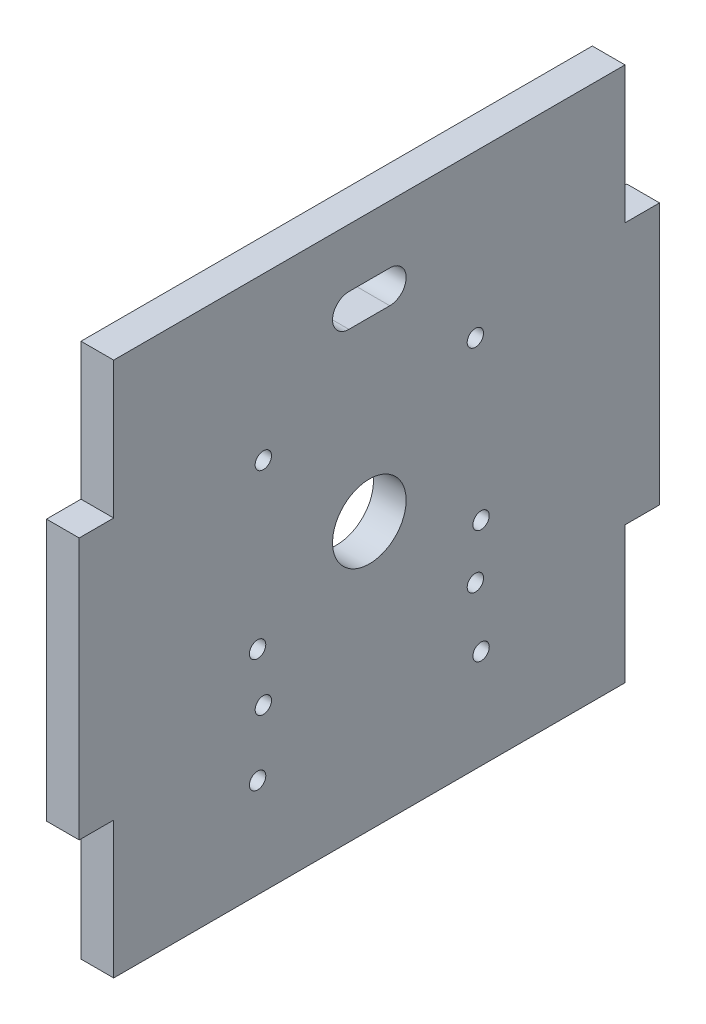
ISO-10303-21;
HEADER;
FILE_DESCRIPTION(('STEP AP214'),'2;1');
FILE_NAME('part.step','',(''),(''),'','','');
FILE_SCHEMA(('AUTOMOTIVE_DESIGN { 1 0 10303 214 1 1 1 1 }'));
ENDSEC;
DATA;
#1=APPLICATION_CONTEXT('core data for automotive mechanical design processes');
#2=APPLICATION_PROTOCOL_DEFINITION('international standard','automotive_design',2000,#1);
#3=PRODUCT_CONTEXT('',#1,'mechanical');
#4=PRODUCT('Part','Part','',(#3));
#5=PRODUCT_RELATED_PRODUCT_CATEGORY('part','',(#4));
#6=PRODUCT_DEFINITION_FORMATION('','',#4);
#7=PRODUCT_DEFINITION_CONTEXT('part definition',#1,'design');
#8=PRODUCT_DEFINITION('design','',#6,#7);
#9=PRODUCT_DEFINITION_SHAPE('','',#8);
#10=(LENGTH_UNIT() NAMED_UNIT(*) SI_UNIT(.MILLI.,.METRE.));
#11=(NAMED_UNIT(*) PLANE_ANGLE_UNIT() SI_UNIT($,.RADIAN.));
#12=(NAMED_UNIT(*) SI_UNIT($,.STERADIAN.) SOLID_ANGLE_UNIT());
#13=UNCERTAINTY_MEASURE_WITH_UNIT(LENGTH_MEASURE(1.E-05),#10,'distance_accuracy_value','');
#14=(GEOMETRIC_REPRESENTATION_CONTEXT(3) GLOBAL_UNCERTAINTY_ASSIGNED_CONTEXT((#13)) GLOBAL_UNIT_ASSIGNED_CONTEXT((#10,
#11,#12)) REPRESENTATION_CONTEXT('',''));
#15=CARTESIAN_POINT('',(0.,0.,0.));
#16=DIRECTION('',(0.,0.,1.));
#17=DIRECTION('',(1.,0.,0.));
#18=AXIS2_PLACEMENT_3D('',#15,#16,#17);
#19=CARTESIAN_POINT('',(431.8,0.,49.6542690784834));
#20=DIRECTION('',(0.,0.,1.));
#21=DIRECTION('',(0.,-1.,0.));
#22=AXIS2_PLACEMENT_3D('',#19,#20,#21);
#23=PLANE('',#22);
#24=DIRECTION('',(0.,-1.,0.));
#25=VECTOR('',#24,1.);
#26=CARTESIAN_POINT('',(438.15,0.,49.6542690784834));
#27=LINE('',#26,#25);
#28=CARTESIAN_POINT('',(438.15,-107.298670187723,49.6542690784833));
#29=VERTEX_POINT('',#28);
#30=CARTESIAN_POINT('',(438.15,-133.862812240734,49.6542690784833));
#31=VERTEX_POINT('',#30);
#32=EDGE_CURVE('E218',#29,#31,#27,.T.);
#33=ORIENTED_EDGE('',*,*,#32,.F.);
#34=DIRECTION('',(1.,0.,0.));
#35=VECTOR('',#34,1.);
#36=CARTESIAN_POINT('',(431.8,-107.298670187723,49.6542690784833));
#37=LINE('',#36,#35);
#38=CARTESIAN_POINT('',(431.8,-107.298670187723,49.6542690784833));
#39=VERTEX_POINT('',#38);
#40=EDGE_CURVE('E11',#39,#29,#37,.T.);
#41=ORIENTED_EDGE('',*,*,#40,.F.);
#42=DIRECTION('',(0.,-1.,0.));
#43=VECTOR('',#42,1.);
#44=CARTESIAN_POINT('',(431.8,0.,49.6542690784834));
#45=LINE('',#44,#43);
#46=CARTESIAN_POINT('',(431.8,-133.862812240734,49.6542690784833));
#47=VERTEX_POINT('',#46);
#48=EDGE_CURVE('E328',#39,#47,#45,.T.);
#49=ORIENTED_EDGE('',*,*,#48,.T.);
#50=DIRECTION('',(1.,0.,0.));
#51=VECTOR('',#50,1.);
#52=CARTESIAN_POINT('',(431.8,-133.862812240734,49.6542690784833));
#53=LINE('',#52,#51);
#54=EDGE_CURVE('E270',#47,#31,#53,.T.);
#55=ORIENTED_EDGE('',*,*,#54,.T.);
#56=EDGE_LOOP('',(#33,#41,#49,#55));
#57=FACE_BOUND('',#56,.T.);
#58=ADVANCED_FACE('F35',(#57),#23,.T.);
#59=CARTESIAN_POINT('',(431.8,-107.298670187723,-2.22183290934961E-13));
#60=DIRECTION('',(0.,-1.,0.));
#61=DIRECTION('',(0.,0.,-1.));
#62=AXIS2_PLACEMENT_3D('',#59,#60,#61);
#63=PLANE('',#62);
#64=DIRECTION('',(0.,0.,-1.));
#65=VECTOR('',#64,1.);
#66=CARTESIAN_POINT('',(438.15,-107.298670187723,-2.22183290934961E-13));
#67=LINE('',#66,#65);
#68=CARTESIAN_POINT('',(438.15,-107.298670187723,56.3562499999999));
#69=VERTEX_POINT('',#68);
#70=EDGE_CURVE('E248',#69,#29,#67,.T.);
#71=ORIENTED_EDGE('',*,*,#70,.F.);
#72=DIRECTION('',(1.,0.,0.));
#73=VECTOR('',#72,1.);
#74=CARTESIAN_POINT('',(431.8,-107.298670187723,56.3562499999999));
#75=LINE('',#74,#73);
#76=CARTESIAN_POINT('',(431.8,-107.298670187723,56.3562499999999));
#77=VERTEX_POINT('',#76);
#78=EDGE_CURVE('E45',#77,#69,#75,.T.);
#79=ORIENTED_EDGE('',*,*,#78,.F.);
#80=DIRECTION('',(0.,0.,-1.));
#81=VECTOR('',#80,1.);
#82=CARTESIAN_POINT('',(431.8,-107.298670187723,-2.22183290934961E-13));
#83=LINE('',#82,#81);
#84=EDGE_CURVE('E170',#77,#39,#83,.T.);
#85=ORIENTED_EDGE('',*,*,#84,.T.);
#86=ORIENTED_EDGE('',*,*,#40,.T.);
#87=EDGE_LOOP('',(#71,#79,#85,#86));
#88=FACE_BOUND('',#87,.T.);
#89=ADVANCED_FACE('F375',(#88),#63,.T.);
#90=CARTESIAN_POINT('',(431.8,0.,56.35625));
#91=DIRECTION('',(0.,0.,1.));
#92=DIRECTION('',(0.,-1.,0.));
#93=AXIS2_PLACEMENT_3D('',#90,#91,#92);
#94=PLANE('',#93);
#95=DIRECTION('',(0.,-1.,0.));
#96=VECTOR('',#95,1.);
#97=CARTESIAN_POINT('',(438.15,0.,56.35625));
#98=LINE('',#97,#96);
#99=CARTESIAN_POINT('',(438.15,-56.4986701877232,56.3562499999999));
#100=VERTEX_POINT('',#99);
#101=EDGE_CURVE('E158',#100,#69,#98,.T.);
#102=ORIENTED_EDGE('',*,*,#101,.F.);
#103=DIRECTION('',(1.,0.,0.));
#104=VECTOR('',#103,1.);
#105=CARTESIAN_POINT('',(431.8,-56.4986701877232,56.3562499999999));
#106=LINE('',#105,#104);
#107=CARTESIAN_POINT('',(431.8,-56.4986701877232,56.3562499999999));
#108=VERTEX_POINT('',#107);
#109=EDGE_CURVE('E153',#108,#100,#106,.T.);
#110=ORIENTED_EDGE('',*,*,#109,.F.);
#111=DIRECTION('',(0.,-1.,0.));
#112=VECTOR('',#111,1.);
#113=CARTESIAN_POINT('',(431.8,0.,56.35625));
#114=LINE('',#113,#112);
#115=EDGE_CURVE('E156',#108,#77,#114,.T.);
#116=ORIENTED_EDGE('',*,*,#115,.T.);
#117=ORIENTED_EDGE('',*,*,#78,.T.);
#118=EDGE_LOOP('',(#102,#110,#116,#117));
#119=FACE_BOUND('',#118,.T.);
#120=ADVANCED_FACE('F155',(#119),#94,.T.);
#121=CARTESIAN_POINT('',(431.8,-56.4986701877232,0.));
#122=DIRECTION('',(0.,1.,0.));
#123=DIRECTION('',(0.,0.,1.));
#124=AXIS2_PLACEMENT_3D('',#121,#122,#123);
#125=PLANE('',#124);
#126=DIRECTION('',(0.,0.,1.));
#127=VECTOR('',#126,1.);
#128=CARTESIAN_POINT('',(438.15,-56.4986701877232,0.));
#129=LINE('',#128,#127);
#130=CARTESIAN_POINT('',(438.15,-56.4986701877232,49.6542690784833));
#131=VERTEX_POINT('',#130);
#132=EDGE_CURVE('E245',#131,#100,#129,.T.);
#133=ORIENTED_EDGE('',*,*,#132,.F.);
#134=DIRECTION('',(1.,0.,0.));
#135=VECTOR('',#134,1.);
#136=CARTESIAN_POINT('',(431.8,-56.4986701877232,49.6542690784833));
#137=LINE('',#136,#135);
#138=CARTESIAN_POINT('',(431.8,-56.4986701877232,49.6542690784833));
#139=VERTEX_POINT('',#138);
#140=EDGE_CURVE('E163',#139,#131,#137,.T.);
#141=ORIENTED_EDGE('',*,*,#140,.F.);
#142=DIRECTION('',(0.,0.,1.));
#143=VECTOR('',#142,1.);
#144=CARTESIAN_POINT('',(431.8,-56.4986701877232,0.));
#145=LINE('',#144,#143);
#146=EDGE_CURVE('E169',#139,#108,#145,.T.);
#147=ORIENTED_EDGE('',*,*,#146,.T.);
#148=ORIENTED_EDGE('',*,*,#109,.T.);
#149=EDGE_LOOP('',(#133,#141,#147,#148));
#150=FACE_BOUND('',#149,.T.);
#151=ADVANCED_FACE('F172',(#150),#125,.T.);
#152=CARTESIAN_POINT('',(431.8,0.,49.6542690784833));
#153=DIRECTION('',(0.,0.,-1.));
#154=DIRECTION('',(0.,1.,0.));
#155=AXIS2_PLACEMENT_3D('',#152,#153,#154);
#156=PLANE('',#155);
#157=DIRECTION('',(0.,1.,0.));
#158=VECTOR('',#157,1.);
#159=CARTESIAN_POINT('',(438.15,0.,49.6542690784833));
#160=LINE('',#159,#158);
#161=CARTESIAN_POINT('',(438.15,-29.9345281347124,49.6542690784833));
#162=VERTEX_POINT('',#161);
#163=EDGE_CURVE('E242',#131,#162,#160,.T.);
#164=ORIENTED_EDGE('',*,*,#163,.T.);
#165=DIRECTION('',(1.,0.,0.));
#166=VECTOR('',#165,1.);
#167=CARTESIAN_POINT('',(431.8,-29.9345281347124,49.6542690784833));
#168=LINE('',#167,#166);
#169=CARTESIAN_POINT('',(431.8,-29.9345281347124,49.6542690784833));
#170=VERTEX_POINT('',#169);
#171=EDGE_CURVE('E254',#170,#162,#168,.T.);
#172=ORIENTED_EDGE('',*,*,#171,.F.);
#173=DIRECTION('',(0.,1.,0.));
#174=VECTOR('',#173,1.);
#175=CARTESIAN_POINT('',(431.8,0.,49.6542690784833));
#176=LINE('',#175,#174);
#177=EDGE_CURVE('E174',#139,#170,#176,.T.);
#178=ORIENTED_EDGE('',*,*,#177,.F.);
#179=ORIENTED_EDGE('',*,*,#140,.T.);
#180=EDGE_LOOP('',(#164,#172,#178,#179));
#181=FACE_BOUND('',#180,.T.);
#182=ADVANCED_FACE('F389',(#181),#156,.F.);
#183=CARTESIAN_POINT('',(431.8,-29.9345281347124,0.));
#184=DIRECTION('',(0.,-1.,0.));
#185=DIRECTION('',(0.,0.,-1.));
#186=AXIS2_PLACEMENT_3D('',#183,#184,#185);
#187=PLANE('',#186);
#188=DIRECTION('',(0.,0.,-1.));
#189=VECTOR('',#188,1.);
#190=CARTESIAN_POINT('',(438.15,-29.9345281347124,0.));
#191=LINE('',#190,#189);
#192=CARTESIAN_POINT('',(438.15,-29.9345281347124,-49.6542690784833));
#193=VERTEX_POINT('',#192);
#194=EDGE_CURVE('E239',#162,#193,#191,.T.);
#195=ORIENTED_EDGE('',*,*,#194,.T.);
#196=DIRECTION('',(1.,0.,0.));
#197=VECTOR('',#196,1.);
#198=CARTESIAN_POINT('',(431.8,-29.9345281347124,-49.6542690784833));
#199=LINE('',#198,#197);
#200=CARTESIAN_POINT('',(431.8,-29.9345281347124,-49.6542690784833));
#201=VERTEX_POINT('',#200);
#202=EDGE_CURVE('E257',#201,#193,#199,.T.);
#203=ORIENTED_EDGE('',*,*,#202,.F.);
#204=DIRECTION('',(0.,0.,-1.));
#205=VECTOR('',#204,1.);
#206=CARTESIAN_POINT('',(431.8,-29.9345281347124,0.));
#207=LINE('',#206,#205);
#208=EDGE_CURVE('E176',#170,#201,#207,.T.);
#209=ORIENTED_EDGE('',*,*,#208,.F.);
#210=ORIENTED_EDGE('',*,*,#171,.T.);
#211=EDGE_LOOP('',(#195,#203,#209,#210));
#212=FACE_BOUND('',#211,.T.);
#213=ADVANCED_FACE('F349',(#212),#187,.F.);
#214=CARTESIAN_POINT('',(431.8,0.,-49.6542690784833));
#215=DIRECTION('',(0.,0.,-1.));
#216=DIRECTION('',(0.,1.,0.));
#217=AXIS2_PLACEMENT_3D('',#214,#215,#216);
#218=PLANE('',#217);
#219=DIRECTION('',(0.,1.,0.));
#220=VECTOR('',#219,1.);
#221=CARTESIAN_POINT('',(438.15,0.,-49.6542690784833));
#222=LINE('',#221,#220);
#223=CARTESIAN_POINT('',(438.15,-56.4986701877232,-49.6542690784833));
#224=VERTEX_POINT('',#223);
#225=EDGE_CURVE('E236',#224,#193,#222,.T.);
#226=ORIENTED_EDGE('',*,*,#225,.F.);
#227=DIRECTION('',(1.,0.,0.));
#228=VECTOR('',#227,1.);
#229=CARTESIAN_POINT('',(431.8,-56.4986701877232,-49.6542690784833));
#230=LINE('',#229,#228);
#231=CARTESIAN_POINT('',(431.8,-56.4986701877232,-49.6542690784833));
#232=VERTEX_POINT('',#231);
#233=EDGE_CURVE('E259',#232,#224,#230,.T.);
#234=ORIENTED_EDGE('',*,*,#233,.F.);
#235=DIRECTION('',(0.,1.,0.));
#236=VECTOR('',#235,1.);
#237=CARTESIAN_POINT('',(431.8,0.,-49.6542690784833));
#238=LINE('',#237,#236);
#239=EDGE_CURVE('E343',#232,#201,#238,.T.);
#240=ORIENTED_EDGE('',*,*,#239,.T.);
#241=ORIENTED_EDGE('',*,*,#202,.T.);
#242=EDGE_LOOP('',(#226,#234,#240,#241));
#243=FACE_BOUND('',#242,.T.);
#244=ADVANCED_FACE('F352',(#243),#218,.T.);
#245=CARTESIAN_POINT('',(431.8,-56.4986701877232,0.));
#246=DIRECTION('',(0.,-1.,0.));
#247=DIRECTION('',(0.,0.,-1.));
#248=AXIS2_PLACEMENT_3D('',#245,#246,#247);
#249=PLANE('',#248);
#250=DIRECTION('',(0.,0.,-1.));
#251=VECTOR('',#250,1.);
#252=CARTESIAN_POINT('',(438.15,-56.4986701877232,0.));
#253=LINE('',#252,#251);
#254=CARTESIAN_POINT('',(438.15,-56.4986701877232,-56.3562500000001));
#255=VERTEX_POINT('',#254);
#256=EDGE_CURVE('E233',#224,#255,#253,.T.);
#257=ORIENTED_EDGE('',*,*,#256,.T.);
#258=DIRECTION('',(1.,0.,0.));
#259=VECTOR('',#258,1.);
#260=CARTESIAN_POINT('',(431.8,-56.4986701877232,-56.3562500000001));
#261=LINE('',#260,#259);
#262=CARTESIAN_POINT('',(431.8,-56.4986701877232,-56.3562500000001));
#263=VERTEX_POINT('',#262);
#264=EDGE_CURVE('E261',#263,#255,#261,.T.);
#265=ORIENTED_EDGE('',*,*,#264,.F.);
#266=DIRECTION('',(0.,0.,-1.));
#267=VECTOR('',#266,1.);
#268=CARTESIAN_POINT('',(431.8,-56.4986701877232,0.));
#269=LINE('',#268,#267);
#270=EDGE_CURVE('E341',#232,#263,#269,.T.);
#271=ORIENTED_EDGE('',*,*,#270,.F.);
#272=ORIENTED_EDGE('',*,*,#233,.T.);
#273=EDGE_LOOP('',(#257,#265,#271,#272));
#274=FACE_BOUND('',#273,.T.);
#275=ADVANCED_FACE('F357',(#274),#249,.F.);
#276=CARTESIAN_POINT('',(431.8,0.,-56.3562500000001));
#277=DIRECTION('',(0.,0.,-1.));
#278=DIRECTION('',(0.,1.,0.));
#279=AXIS2_PLACEMENT_3D('',#276,#277,#278);
#280=PLANE('',#279);
#281=DIRECTION('',(0.,1.,0.));
#282=VECTOR('',#281,1.);
#283=CARTESIAN_POINT('',(438.15,0.,-56.3562500000001));
#284=LINE('',#283,#282);
#285=CARTESIAN_POINT('',(438.15,-107.298670187723,-56.3562500000001));
#286=VERTEX_POINT('',#285);
#287=EDGE_CURVE('E230',#286,#255,#284,.T.);
#288=ORIENTED_EDGE('',*,*,#287,.F.);
#289=DIRECTION('',(1.,0.,0.));
#290=VECTOR('',#289,1.);
#291=CARTESIAN_POINT('',(431.8,-107.298670187723,-56.3562500000001));
#292=LINE('',#291,#290);
#293=CARTESIAN_POINT('',(431.8,-107.298670187723,-56.3562500000001));
#294=VERTEX_POINT('',#293);
#295=EDGE_CURVE('E263',#294,#286,#292,.T.);
#296=ORIENTED_EDGE('',*,*,#295,.F.);
#297=DIRECTION('',(0.,1.,0.));
#298=VECTOR('',#297,1.);
#299=CARTESIAN_POINT('',(431.8,0.,-56.3562500000001));
#300=LINE('',#299,#298);
#301=EDGE_CURVE('E338',#294,#263,#300,.T.);
#302=ORIENTED_EDGE('',*,*,#301,.T.);
#303=ORIENTED_EDGE('',*,*,#264,.T.);
#304=EDGE_LOOP('',(#288,#296,#302,#303));
#305=FACE_BOUND('',#304,.T.);
#306=ADVANCED_FACE('F363',(#305),#280,.T.);
#307=CARTESIAN_POINT('',(431.8,-107.298670187723,2.22183290934961E-13));
#308=DIRECTION('',(0.,1.,0.));
#309=DIRECTION('',(0.,0.,1.));
#310=AXIS2_PLACEMENT_3D('',#307,#308,#309);
#311=PLANE('',#310);
#312=DIRECTION('',(0.,0.,1.));
#313=VECTOR('',#312,1.);
#314=CARTESIAN_POINT('',(438.15,-107.298670187723,2.22183290934961E-13));
#315=LINE('',#314,#313);
#316=CARTESIAN_POINT('',(438.15,-107.298670187723,-49.6542690784833));
#317=VERTEX_POINT('',#316);
#318=EDGE_CURVE('E227',#286,#317,#315,.T.);
#319=ORIENTED_EDGE('',*,*,#318,.T.);
#320=DIRECTION('',(1.,0.,0.));
#321=VECTOR('',#320,1.);
#322=CARTESIAN_POINT('',(431.8,-107.298670187723,-49.6542690784833));
#323=LINE('',#322,#321);
#324=CARTESIAN_POINT('',(431.8,-107.298670187723,-49.6542690784833));
#325=VERTEX_POINT('',#324);
#326=EDGE_CURVE('E265',#325,#317,#323,.T.);
#327=ORIENTED_EDGE('',*,*,#326,.F.);
#328=DIRECTION('',(0.,0.,1.));
#329=VECTOR('',#328,1.);
#330=CARTESIAN_POINT('',(431.8,-107.298670187723,2.22183290934961E-13));
#331=LINE('',#330,#329);
#332=EDGE_CURVE('E335',#294,#325,#331,.T.);
#333=ORIENTED_EDGE('',*,*,#332,.F.);
#334=ORIENTED_EDGE('',*,*,#295,.T.);
#335=EDGE_LOOP('',(#319,#327,#333,#334));
#336=FACE_BOUND('',#335,.T.);
#337=ADVANCED_FACE('F366',(#336),#311,.F.);
#338=CARTESIAN_POINT('',(431.8,0.,-49.6542690784835));
#339=DIRECTION('',(0.,0.,1.));
#340=DIRECTION('',(0.,-1.,0.));
#341=AXIS2_PLACEMENT_3D('',#338,#339,#340);
#342=PLANE('',#341);
#343=DIRECTION('',(0.,-1.,0.));
#344=VECTOR('',#343,1.);
#345=CARTESIAN_POINT('',(438.15,0.,-49.6542690784835));
#346=LINE('',#345,#344);
#347=CARTESIAN_POINT('',(438.15,-133.862812240734,-49.6542690784833));
#348=VERTEX_POINT('',#347);
#349=EDGE_CURVE('E224',#317,#348,#346,.T.);
#350=ORIENTED_EDGE('',*,*,#349,.T.);
#351=DIRECTION('',(1.,0.,0.));
#352=VECTOR('',#351,1.);
#353=CARTESIAN_POINT('',(431.8,-133.862812240734,-49.6542690784833));
#354=LINE('',#353,#352);
#355=CARTESIAN_POINT('',(431.8,-133.862812240734,-49.6542690784833));
#356=VERTEX_POINT('',#355);
#357=EDGE_CURVE('E268',#356,#348,#354,.T.);
#358=ORIENTED_EDGE('',*,*,#357,.F.);
#359=DIRECTION('',(0.,-1.,0.));
#360=VECTOR('',#359,1.);
#361=CARTESIAN_POINT('',(431.8,0.,-49.6542690784835));
#362=LINE('',#361,#360);
#363=EDGE_CURVE('E333',#325,#356,#362,.T.);
#364=ORIENTED_EDGE('',*,*,#363,.F.);
#365=ORIENTED_EDGE('',*,*,#326,.T.);
#366=EDGE_LOOP('',(#350,#358,#364,#365));
#367=FACE_BOUND('',#366,.T.);
#368=ADVANCED_FACE('F368',(#367),#342,.F.);
#369=CARTESIAN_POINT('',(431.8,-44.4251705083649,-3.96875000000001));
#370=DIRECTION('',(1.,0.,0.));
#371=DIRECTION('',(0.,0.,-1.));
#372=AXIS2_PLACEMENT_3D('',#369,#370,#371);
#373=CYLINDRICAL_SURFACE('',#372,3.17500000000001);
#374=CARTESIAN_POINT('',(438.15,-44.4251705083649,-3.96875000000001));
#375=DIRECTION('',(1.,0.,0.));
#376=DIRECTION('',(0.,0.,-1.));
#377=AXIS2_PLACEMENT_3D('',#374,#375,#376);
#378=CIRCLE('',#377,3.17500000000001);
#379=CARTESIAN_POINT('',(438.15,-47.6001705083649,-3.96875000000001));
#380=VERTEX_POINT('',#379);
#381=CARTESIAN_POINT('',(438.15,-41.2501705083649,-3.96875000000001));
#382=VERTEX_POINT('',#381);
#383=EDGE_CURVE('E181',#380,#382,#378,.T.);
#384=ORIENTED_EDGE('',*,*,#383,.T.);
#385=DIRECTION('',(1.,0.,0.));
#386=VECTOR('',#385,1.);
#387=CARTESIAN_POINT('',(431.8,-41.2501705083649,-3.96875000000001));
#388=LINE('',#387,#386);
#389=CARTESIAN_POINT('',(431.8,-41.2501705083649,-3.96875000000001));
#390=VERTEX_POINT('',#389);
#391=EDGE_CURVE('E272',#390,#382,#388,.T.);
#392=ORIENTED_EDGE('',*,*,#391,.F.);
#393=CARTESIAN_POINT('',(431.8,-44.4251705083649,-3.96875000000001));
#394=DIRECTION('',(1.,0.,0.));
#395=DIRECTION('',(0.,0.,-1.));
#396=AXIS2_PLACEMENT_3D('',#393,#394,#395);
#397=CIRCLE('',#396,3.17500000000001);
#398=CARTESIAN_POINT('',(431.8,-47.6001705083649,-3.96875000000001));
#399=VERTEX_POINT('',#398);
#400=EDGE_CURVE('E250',#399,#390,#397,.T.);
#401=ORIENTED_EDGE('',*,*,#400,.F.);
#402=DIRECTION('',(1.,0.,0.));
#403=VECTOR('',#402,1.);
#404=CARTESIAN_POINT('',(431.8,-47.6001705083649,-3.96875000000001));
#405=LINE('',#404,#403);
#406=EDGE_CURVE('E39',#399,#380,#405,.T.);
#407=ORIENTED_EDGE('',*,*,#406,.T.);
#408=EDGE_LOOP('',(#384,#392,#401,#407));
#409=FACE_BOUND('',#408,.T.);
#410=ADVANCED_FACE('F37',(#409),#373,.F.);
#411=CARTESIAN_POINT('',(431.8,-41.2501705083649,0.));
#412=DIRECTION('',(0.,-1.,0.));
#413=DIRECTION('',(0.,0.,-1.));
#414=AXIS2_PLACEMENT_3D('',#411,#412,#413);
#415=PLANE('',#414);
#416=DIRECTION('',(0.,0.,-1.));
#417=VECTOR('',#416,1.);
#418=CARTESIAN_POINT('',(438.15,-41.2501705083649,0.));
#419=LINE('',#418,#417);
#420=CARTESIAN_POINT('',(438.15,-41.2501705083649,3.96874999999999));
#421=VERTEX_POINT('',#420);
#422=EDGE_CURVE('E188',#421,#382,#419,.T.);
#423=ORIENTED_EDGE('',*,*,#422,.F.);
#424=DIRECTION('',(1.,0.,0.));
#425=VECTOR('',#424,1.);
#426=CARTESIAN_POINT('',(431.8,-41.2501705083649,3.96874999999999));
#427=LINE('',#426,#425);
#428=CARTESIAN_POINT('',(431.8,-41.2501705083649,3.96874999999999));
#429=VERTEX_POINT('',#428);
#430=EDGE_CURVE('E274',#429,#421,#427,.T.);
#431=ORIENTED_EDGE('',*,*,#430,.F.);
#432=DIRECTION('',(0.,0.,-1.));
#433=VECTOR('',#432,1.);
#434=CARTESIAN_POINT('',(431.8,-41.2501705083649,0.));
#435=LINE('',#434,#433);
#436=EDGE_CURVE('E295',#429,#390,#435,.T.);
#437=ORIENTED_EDGE('',*,*,#436,.T.);
#438=ORIENTED_EDGE('',*,*,#391,.T.);
#439=EDGE_LOOP('',(#423,#431,#437,#438));
#440=FACE_BOUND('',#439,.T.);
#441=ADVANCED_FACE('F291',(#440),#415,.T.);
#442=CARTESIAN_POINT('',(431.8,-44.4251705083649,3.96874999999999));
#443=DIRECTION('',(1.,0.,0.));
#444=DIRECTION('',(0.,0.,-1.));
#445=AXIS2_PLACEMENT_3D('',#442,#443,#444);
#446=CYLINDRICAL_SURFACE('',#445,3.17500000000001);
#447=CARTESIAN_POINT('',(438.15,-44.4251705083649,3.96874999999999));
#448=DIRECTION('',(1.,0.,0.));
#449=DIRECTION('',(0.,0.,-1.));
#450=AXIS2_PLACEMENT_3D('',#447,#448,#449);
#451=CIRCLE('',#450,3.17500000000001);
#452=CARTESIAN_POINT('',(438.15,-47.6001705083649,3.96874999999999));
#453=VERTEX_POINT('',#452);
#454=EDGE_CURVE('E186',#421,#453,#451,.T.);
#455=ORIENTED_EDGE('',*,*,#454,.T.);
#456=DIRECTION('',(1.,0.,0.));
#457=VECTOR('',#456,1.);
#458=CARTESIAN_POINT('',(431.8,-47.6001705083649,3.96874999999999));
#459=LINE('',#458,#457);
#460=CARTESIAN_POINT('',(431.8,-47.6001705083649,3.96874999999999));
#461=VERTEX_POINT('',#460);
#462=EDGE_CURVE('E275',#461,#453,#459,.T.);
#463=ORIENTED_EDGE('',*,*,#462,.F.);
#464=CARTESIAN_POINT('',(431.8,-44.4251705083649,3.96874999999999));
#465=DIRECTION('',(1.,0.,0.));
#466=DIRECTION('',(0.,0.,-1.));
#467=AXIS2_PLACEMENT_3D('',#464,#465,#466);
#468=CIRCLE('',#467,3.17500000000001);
#469=EDGE_CURVE('E297',#429,#461,#468,.T.);
#470=ORIENTED_EDGE('',*,*,#469,.F.);
#471=ORIENTED_EDGE('',*,*,#430,.T.);
#472=EDGE_LOOP('',(#455,#463,#470,#471));
#473=FACE_BOUND('',#472,.T.);
#474=ADVANCED_FACE('F412',(#473),#446,.F.);
#475=CARTESIAN_POINT('',(431.8,-81.8986701877232,0.));
#476=DIRECTION('',(1.,0.,0.));
#477=DIRECTION('',(0.,0.,-1.));
#478=AXIS2_PLACEMENT_3D('',#475,#476,#477);
#479=CYLINDRICAL_SURFACE('',#478,7.14375);
#480=CARTESIAN_POINT('',(431.8,-81.8986701877232,0.));
#481=DIRECTION('',(1.,0.,0.));
#482=DIRECTION('',(0.,0.,-1.));
#483=AXIS2_PLACEMENT_3D('',#480,#481,#482);
#484=CIRCLE('',#483,7.14375);
#485=CARTESIAN_POINT('',(431.8,-81.8986701877232,-7.14375));
#486=VERTEX_POINT('',#485);
#487=EDGE_CURVE('E325',#486,#486,#484,.T.);
#488=ORIENTED_EDGE('',*,*,#487,.F.);
#489=EDGE_LOOP('',(#488));
#490=FACE_BOUND('',#489,.T.);
#491=CARTESIAN_POINT('',(438.15,-81.8986701877232,0.));
#492=DIRECTION('',(1.,0.,0.));
#493=DIRECTION('',(0.,0.,-1.));
#494=AXIS2_PLACEMENT_3D('',#491,#492,#493);
#495=CIRCLE('',#494,7.14375);
#496=CARTESIAN_POINT('',(438.15,-81.8986701877232,-7.14375));
#497=VERTEX_POINT('',#496);
#498=EDGE_CURVE('E215',#497,#497,#495,.T.);
#499=ORIENTED_EDGE('',*,*,#498,.T.);
#500=EDGE_LOOP('',(#499));
#501=FACE_BOUND('',#500,.T.);
#502=ADVANCED_FACE('F408',(#490,#501),#479,.F.);
#503=CARTESIAN_POINT('',(431.8,-114.617733912439,21.7));
#504=DIRECTION('',(1.,0.,0.));
#505=DIRECTION('',(0.,0.,-1.));
#506=AXIS2_PLACEMENT_3D('',#503,#504,#505);
#507=CYLINDRICAL_SURFACE('',#506,1.5875);
#508=CARTESIAN_POINT('',(431.8,-114.617733912439,21.7));
#509=DIRECTION('',(1.,0.,0.));
#510=DIRECTION('',(0.,0.,-1.));
#511=AXIS2_PLACEMENT_3D('',#508,#509,#510);
#512=CIRCLE('',#511,1.5875);
#513=CARTESIAN_POINT('',(431.8,-114.617733912439,20.1125));
#514=VERTEX_POINT('',#513);
#515=EDGE_CURVE('E322',#514,#514,#512,.T.);
#516=ORIENTED_EDGE('',*,*,#515,.F.);
#517=EDGE_LOOP('',(#516));
#518=FACE_BOUND('',#517,.T.);
#519=CARTESIAN_POINT('',(438.15,-114.617733912439,21.7));
#520=DIRECTION('',(1.,0.,0.));
#521=DIRECTION('',(0.,0.,-1.));
#522=AXIS2_PLACEMENT_3D('',#519,#520,#521);
#523=CIRCLE('',#522,1.5875);
#524=CARTESIAN_POINT('',(438.15,-114.617733912439,20.1125));
#525=VERTEX_POINT('',#524);
#526=EDGE_CURVE('E212',#525,#525,#523,.T.);
#527=ORIENTED_EDGE('',*,*,#526,.T.);
#528=EDGE_LOOP('',(#527));
#529=FACE_BOUND('',#528,.T.);
#530=ADVANCED_FACE('F411',(#518,#529),#507,.F.);
#531=CARTESIAN_POINT('',(431.8,-92.5377339124392,21.7));
#532=DIRECTION('',(1.,0.,0.));
#533=DIRECTION('',(0.,0.,-1.));
#534=AXIS2_PLACEMENT_3D('',#531,#532,#533);
#535=CYLINDRICAL_SURFACE('',#534,1.5875);
#536=CARTESIAN_POINT('',(431.8,-92.5377339124392,21.7));
#537=DIRECTION('',(1.,0.,0.));
#538=DIRECTION('',(0.,0.,-1.));
#539=AXIS2_PLACEMENT_3D('',#536,#537,#538);
#540=CIRCLE('',#539,1.5875);
#541=CARTESIAN_POINT('',(431.8,-92.5377339124392,20.1125));
#542=VERTEX_POINT('',#541);
#543=EDGE_CURVE('E319',#542,#542,#540,.T.);
#544=ORIENTED_EDGE('',*,*,#543,.F.);
#545=EDGE_LOOP('',(#544));
#546=FACE_BOUND('',#545,.T.);
#547=CARTESIAN_POINT('',(438.15,-92.5377339124392,21.7));
#548=DIRECTION('',(1.,0.,0.));
#549=DIRECTION('',(0.,0.,-1.));
#550=AXIS2_PLACEMENT_3D('',#547,#548,#549);
#551=CIRCLE('',#550,1.5875);
#552=CARTESIAN_POINT('',(438.15,-92.5377339124392,20.1125));
#553=VERTEX_POINT('',#552);
#554=EDGE_CURVE('E209',#553,#553,#551,.T.);
#555=ORIENTED_EDGE('',*,*,#554,.T.);
#556=EDGE_LOOP('',(#555));
#557=FACE_BOUND('',#556,.T.);
#558=ADVANCED_FACE('F416',(#546,#557),#535,.F.);
#559=CARTESIAN_POINT('',(431.8,-92.5377339124392,-21.7));
#560=DIRECTION('',(1.,0.,0.));
#561=DIRECTION('',(0.,0.,-1.));
#562=AXIS2_PLACEMENT_3D('',#559,#560,#561);
#563=CYLINDRICAL_SURFACE('',#562,1.5875);
#564=CARTESIAN_POINT('',(431.8,-92.5377339124392,-21.7));
#565=DIRECTION('',(1.,0.,0.));
#566=DIRECTION('',(0.,0.,-1.));
#567=AXIS2_PLACEMENT_3D('',#564,#565,#566);
#568=CIRCLE('',#567,1.5875);
#569=CARTESIAN_POINT('',(431.8,-92.5377339124392,-23.2875));
#570=VERTEX_POINT('',#569);
#571=EDGE_CURVE('E316',#570,#570,#568,.T.);
#572=ORIENTED_EDGE('',*,*,#571,.F.);
#573=EDGE_LOOP('',(#572));
#574=FACE_BOUND('',#573,.T.);
#575=CARTESIAN_POINT('',(438.15,-92.5377339124392,-21.7));
#576=DIRECTION('',(1.,0.,0.));
#577=DIRECTION('',(0.,0.,-1.));
#578=AXIS2_PLACEMENT_3D('',#575,#576,#577);
#579=CIRCLE('',#578,1.5875);
#580=CARTESIAN_POINT('',(438.15,-92.5377339124392,-23.2875));
#581=VERTEX_POINT('',#580);
#582=EDGE_CURVE('E206',#581,#581,#579,.T.);
#583=ORIENTED_EDGE('',*,*,#582,.T.);
#584=EDGE_LOOP('',(#583));
#585=FACE_BOUND('',#584,.T.);
#586=ADVANCED_FACE('F420',(#574,#585),#563,.F.);
#587=CARTESIAN_POINT('',(431.8,-114.617733912439,-21.7));
#588=DIRECTION('',(1.,0.,0.));
#589=DIRECTION('',(0.,0.,-1.));
#590=AXIS2_PLACEMENT_3D('',#587,#588,#589);
#591=CYLINDRICAL_SURFACE('',#590,1.5875);
#592=CARTESIAN_POINT('',(431.8,-114.617733912439,-21.7));
#593=DIRECTION('',(1.,0.,0.));
#594=DIRECTION('',(0.,0.,-1.));
#595=AXIS2_PLACEMENT_3D('',#592,#593,#594);
#596=CIRCLE('',#595,1.5875);
#597=CARTESIAN_POINT('',(431.8,-114.617733912439,-23.2875));
#598=VERTEX_POINT('',#597);
#599=EDGE_CURVE('E313',#598,#598,#596,.T.);
#600=ORIENTED_EDGE('',*,*,#599,.F.);
#601=EDGE_LOOP('',(#600));
#602=FACE_BOUND('',#601,.T.);
#603=CARTESIAN_POINT('',(438.15,-114.617733912439,-21.7));
#604=DIRECTION('',(1.,0.,0.));
#605=DIRECTION('',(0.,0.,-1.));
#606=AXIS2_PLACEMENT_3D('',#603,#604,#605);
#607=CIRCLE('',#606,1.5875);
#608=CARTESIAN_POINT('',(438.15,-114.617733912439,-23.2875));
#609=VERTEX_POINT('',#608);
#610=EDGE_CURVE('E203',#609,#609,#607,.T.);
#611=ORIENTED_EDGE('',*,*,#610,.T.);
#612=EDGE_LOOP('',(#611));
#613=FACE_BOUND('',#612,.T.);
#614=ADVANCED_FACE('F424',(#602,#613),#591,.F.);
#615=CARTESIAN_POINT('',(431.8,-61.3069429021117,20.5917272856116));
#616=DIRECTION('',(1.,0.,0.));
#617=DIRECTION('',(0.,0.,-1.));
#618=AXIS2_PLACEMENT_3D('',#615,#616,#617);
#619=CYLINDRICAL_SURFACE('',#618,1.5875);
#620=CARTESIAN_POINT('',(431.8,-61.3069429021117,20.5917272856116));
#621=DIRECTION('',(1.,0.,0.));
#622=DIRECTION('',(0.,0.,-1.));
#623=AXIS2_PLACEMENT_3D('',#620,#621,#622);
#624=CIRCLE('',#623,1.5875);
#625=CARTESIAN_POINT('',(431.8,-61.3069429021117,19.0042272856116));
#626=VERTEX_POINT('',#625);
#627=EDGE_CURVE('E310',#626,#626,#624,.T.);
#628=ORIENTED_EDGE('',*,*,#627,.F.);
#629=EDGE_LOOP('',(#628));
#630=FACE_BOUND('',#629,.T.);
#631=CARTESIAN_POINT('',(438.15,-61.3069429021117,20.5917272856116));
#632=DIRECTION('',(1.,0.,0.));
#633=DIRECTION('',(0.,0.,-1.));
#634=AXIS2_PLACEMENT_3D('',#631,#632,#633);
#635=CIRCLE('',#634,1.5875);
#636=CARTESIAN_POINT('',(438.15,-61.3069429021117,19.0042272856116));
#637=VERTEX_POINT('',#636);
#638=EDGE_CURVE('E200',#637,#637,#635,.T.);
#639=ORIENTED_EDGE('',*,*,#638,.T.);
#640=EDGE_LOOP('',(#639));
#641=FACE_BOUND('',#640,.T.);
#642=ADVANCED_FACE('F428',(#630,#641),#619,.F.);
#643=CARTESIAN_POINT('',(431.8,-61.3069429021116,-20.5917272856115));
#644=DIRECTION('',(1.,0.,0.));
#645=DIRECTION('',(0.,0.,-1.));
#646=AXIS2_PLACEMENT_3D('',#643,#644,#645);
#647=CYLINDRICAL_SURFACE('',#646,1.58749999999999);
#648=CARTESIAN_POINT('',(431.8,-61.3069429021116,-20.5917272856115));
#649=DIRECTION('',(1.,0.,0.));
#650=DIRECTION('',(0.,0.,-1.));
#651=AXIS2_PLACEMENT_3D('',#648,#649,#650);
#652=CIRCLE('',#651,1.58749999999999);
#653=CARTESIAN_POINT('',(431.8,-61.3069429021116,-22.1792272856115));
#654=VERTEX_POINT('',#653);
#655=EDGE_CURVE('E307',#654,#654,#652,.T.);
#656=ORIENTED_EDGE('',*,*,#655,.F.);
#657=EDGE_LOOP('',(#656));
#658=FACE_BOUND('',#657,.T.);
#659=CARTESIAN_POINT('',(438.15,-61.3069429021116,-20.5917272856115));
#660=DIRECTION('',(1.,0.,0.));
#661=DIRECTION('',(0.,0.,-1.));
#662=AXIS2_PLACEMENT_3D('',#659,#660,#661);
#663=CIRCLE('',#662,1.58749999999999);
#664=CARTESIAN_POINT('',(438.15,-61.3069429021116,-22.1792272856115));
#665=VERTEX_POINT('',#664);
#666=EDGE_CURVE('E197',#665,#665,#663,.T.);
#667=ORIENTED_EDGE('',*,*,#666,.T.);
#668=EDGE_LOOP('',(#667));
#669=FACE_BOUND('',#668,.T.);
#670=ADVANCED_FACE('F432',(#658,#669),#647,.F.);
#671=CARTESIAN_POINT('',(431.8,-102.490397473335,-20.5917272856116));
#672=DIRECTION('',(1.,0.,0.));
#673=DIRECTION('',(0.,0.,-1.));
#674=AXIS2_PLACEMENT_3D('',#671,#672,#673);
#675=CYLINDRICAL_SURFACE('',#674,1.5875);
#676=CARTESIAN_POINT('',(431.8,-102.490397473335,-20.5917272856116));
#677=DIRECTION('',(1.,0.,0.));
#678=DIRECTION('',(0.,0.,-1.));
#679=AXIS2_PLACEMENT_3D('',#676,#677,#678);
#680=CIRCLE('',#679,1.5875);
#681=CARTESIAN_POINT('',(431.8,-102.490397473335,-22.1792272856116));
#682=VERTEX_POINT('',#681);
#683=EDGE_CURVE('E300',#682,#682,#680,.T.);
#684=ORIENTED_EDGE('',*,*,#683,.F.);
#685=EDGE_LOOP('',(#684));
#686=FACE_BOUND('',#685,.T.);
#687=CARTESIAN_POINT('',(438.15,-102.490397473335,-20.5917272856116));
#688=DIRECTION('',(1.,0.,0.));
#689=DIRECTION('',(0.,0.,-1.));
#690=AXIS2_PLACEMENT_3D('',#687,#688,#689);
#691=CIRCLE('',#690,1.5875);
#692=CARTESIAN_POINT('',(438.15,-102.490397473335,-22.1792272856116));
#693=VERTEX_POINT('',#692);
#694=EDGE_CURVE('E194',#693,#693,#691,.T.);
#695=ORIENTED_EDGE('',*,*,#694,.T.);
#696=EDGE_LOOP('',(#695));
#697=FACE_BOUND('',#696,.T.);
#698=ADVANCED_FACE('F436',(#686,#697),#675,.F.);
#699=CARTESIAN_POINT('',(431.8,-102.490397473335,20.5917272856115));
#700=DIRECTION('',(1.,0.,0.));
#701=DIRECTION('',(0.,0.,-1.));
#702=AXIS2_PLACEMENT_3D('',#699,#700,#701);
#703=CYLINDRICAL_SURFACE('',#702,1.5875);
#704=CARTESIAN_POINT('',(431.8,-102.490397473335,20.5917272856115));
#705=DIRECTION('',(1.,0.,0.));
#706=DIRECTION('',(0.,0.,-1.));
#707=AXIS2_PLACEMENT_3D('',#704,#705,#706);
#708=CIRCLE('',#707,1.5875);
#709=CARTESIAN_POINT('',(431.8,-102.490397473335,19.0042272856115));
#710=VERTEX_POINT('',#709);
#711=EDGE_CURVE('E296',#710,#710,#708,.T.);
#712=ORIENTED_EDGE('',*,*,#711,.F.);
#713=EDGE_LOOP('',(#712));
#714=FACE_BOUND('',#713,.T.);
#715=CARTESIAN_POINT('',(438.15,-102.490397473335,20.5917272856115));
#716=DIRECTION('',(1.,0.,0.));
#717=DIRECTION('',(0.,0.,-1.));
#718=AXIS2_PLACEMENT_3D('',#715,#716,#717);
#719=CIRCLE('',#718,1.5875);
#720=CARTESIAN_POINT('',(438.15,-102.490397473335,19.0042272856115));
#721=VERTEX_POINT('',#720);
#722=EDGE_CURVE('E191',#721,#721,#719,.T.);
#723=ORIENTED_EDGE('',*,*,#722,.T.);
#724=EDGE_LOOP('',(#723));
#725=FACE_BOUND('',#724,.T.);
#726=ADVANCED_FACE('F440',(#714,#725),#703,.F.);
#727=CARTESIAN_POINT('',(431.8,-47.6001705083649,0.));
#728=DIRECTION('',(0.,-1.,0.));
#729=DIRECTION('',(0.,0.,-1.));
#730=AXIS2_PLACEMENT_3D('',#727,#728,#729);
#731=PLANE('',#730);
#732=DIRECTION('',(0.,0.,-1.));
#733=VECTOR('',#732,1.);
#734=CARTESIAN_POINT('',(438.15,-47.6001705083649,0.));
#735=LINE('',#734,#733);
#736=EDGE_CURVE('E184',#453,#380,#735,.T.);
#737=ORIENTED_EDGE('',*,*,#736,.T.);
#738=ORIENTED_EDGE('',*,*,#406,.F.);
#739=DIRECTION('',(0.,0.,-1.));
#740=VECTOR('',#739,1.);
#741=CARTESIAN_POINT('',(431.8,-47.6001705083649,0.));
#742=LINE('',#741,#740);
#743=EDGE_CURVE('E117',#461,#399,#742,.T.);
#744=ORIENTED_EDGE('',*,*,#743,.F.);
#745=ORIENTED_EDGE('',*,*,#462,.T.);
#746=EDGE_LOOP('',(#737,#738,#744,#745));
#747=FACE_BOUND('',#746,.T.);
#748=ADVANCED_FACE('F406',(#747),#731,.F.);
#749=CARTESIAN_POINT('',(431.8,-133.862812240734,0.));
#750=DIRECTION('',(0.,-1.,0.));
#751=DIRECTION('',(0.,0.,-1.));
#752=AXIS2_PLACEMENT_3D('',#749,#750,#751);
#753=PLANE('',#752);
#754=DIRECTION('',(0.,0.,-1.));
#755=VECTOR('',#754,1.);
#756=CARTESIAN_POINT('',(438.15,-133.862812240734,0.));
#757=LINE('',#756,#755);
#758=EDGE_CURVE('E221',#31,#348,#757,.T.);
#759=ORIENTED_EDGE('',*,*,#758,.F.);
#760=ORIENTED_EDGE('',*,*,#54,.F.);
#761=DIRECTION('',(0.,0.,-1.));
#762=VECTOR('',#761,1.);
#763=CARTESIAN_POINT('',(431.8,-133.862812240734,0.));
#764=LINE('',#763,#762);
#765=EDGE_CURVE('E330',#47,#356,#764,.T.);
#766=ORIENTED_EDGE('',*,*,#765,.T.);
#767=ORIENTED_EDGE('',*,*,#357,.T.);
#768=EDGE_LOOP('',(#759,#760,#766,#767));
#769=FACE_BOUND('',#768,.T.);
#770=ADVANCED_FACE('F373',(#769),#753,.T.);
#771=CARTESIAN_POINT('',(431.8,0.,0.));
#772=DIRECTION('',(1.,0.,0.));
#773=DIRECTION('',(0.,0.,-1.));
#774=AXIS2_PLACEMENT_3D('',#771,#772,#773);
#775=PLANE('',#774);
#776=ORIENTED_EDGE('',*,*,#400,.T.);
#777=ORIENTED_EDGE('',*,*,#436,.F.);
#778=ORIENTED_EDGE('',*,*,#469,.T.);
#779=ORIENTED_EDGE('',*,*,#743,.T.);
#780=EDGE_LOOP('',(#776,#777,#778,#779));
#781=FACE_BOUND('',#780,.T.);
#782=ORIENTED_EDGE('',*,*,#711,.T.);
#783=EDGE_LOOP('',(#782));
#784=FACE_BOUND('',#783,.T.);
#785=ORIENTED_EDGE('',*,*,#683,.T.);
#786=EDGE_LOOP('',(#785));
#787=FACE_BOUND('',#786,.T.);
#788=ORIENTED_EDGE('',*,*,#655,.T.);
#789=EDGE_LOOP('',(#788));
#790=FACE_BOUND('',#789,.T.);
#791=ORIENTED_EDGE('',*,*,#627,.T.);
#792=EDGE_LOOP('',(#791));
#793=FACE_BOUND('',#792,.T.);
#794=ORIENTED_EDGE('',*,*,#599,.T.);
#795=EDGE_LOOP('',(#794));
#796=FACE_BOUND('',#795,.T.);
#797=ORIENTED_EDGE('',*,*,#571,.T.);
#798=EDGE_LOOP('',(#797));
#799=FACE_BOUND('',#798,.T.);
#800=ORIENTED_EDGE('',*,*,#543,.T.);
#801=EDGE_LOOP('',(#800));
#802=FACE_BOUND('',#801,.T.);
#803=ORIENTED_EDGE('',*,*,#515,.T.);
#804=EDGE_LOOP('',(#803));
#805=FACE_BOUND('',#804,.T.);
#806=ORIENTED_EDGE('',*,*,#487,.T.);
#807=EDGE_LOOP('',(#806));
#808=FACE_BOUND('',#807,.T.);
#809=ORIENTED_EDGE('',*,*,#48,.F.);
#810=ORIENTED_EDGE('',*,*,#84,.F.);
#811=ORIENTED_EDGE('',*,*,#115,.F.);
#812=ORIENTED_EDGE('',*,*,#146,.F.);
#813=ORIENTED_EDGE('',*,*,#177,.T.);
#814=ORIENTED_EDGE('',*,*,#208,.T.);
#815=ORIENTED_EDGE('',*,*,#239,.F.);
#816=ORIENTED_EDGE('',*,*,#270,.T.);
#817=ORIENTED_EDGE('',*,*,#301,.F.);
#818=ORIENTED_EDGE('',*,*,#332,.T.);
#819=ORIENTED_EDGE('',*,*,#363,.T.);
#820=ORIENTED_EDGE('',*,*,#765,.F.);
#821=EDGE_LOOP('',(#809,#810,#811,#812,#813,#814,#815,#816,#817,#818,#819,#820));
#822=FACE_BOUND('',#821,.T.);
#823=ADVANCED_FACE('F167',(#781,#784,#787,#790,#793,#796,#799,#802,#805,#808,#822),#775,.F.);
#824=CARTESIAN_POINT('',(438.15,0.,0.));
#825=DIRECTION('',(1.,0.,0.));
#826=DIRECTION('',(0.,0.,-1.));
#827=AXIS2_PLACEMENT_3D('',#824,#825,#826);
#828=PLANE('',#827);
#829=ORIENTED_EDGE('',*,*,#383,.F.);
#830=ORIENTED_EDGE('',*,*,#736,.F.);
#831=ORIENTED_EDGE('',*,*,#454,.F.);
#832=ORIENTED_EDGE('',*,*,#422,.T.);
#833=EDGE_LOOP('',(#829,#830,#831,#832));
#834=FACE_BOUND('',#833,.T.);
#835=ORIENTED_EDGE('',*,*,#722,.F.);
#836=EDGE_LOOP('',(#835));
#837=FACE_BOUND('',#836,.T.);
#838=ORIENTED_EDGE('',*,*,#694,.F.);
#839=EDGE_LOOP('',(#838));
#840=FACE_BOUND('',#839,.T.);
#841=ORIENTED_EDGE('',*,*,#666,.F.);
#842=EDGE_LOOP('',(#841));
#843=FACE_BOUND('',#842,.T.);
#844=ORIENTED_EDGE('',*,*,#638,.F.);
#845=EDGE_LOOP('',(#844));
#846=FACE_BOUND('',#845,.T.);
#847=ORIENTED_EDGE('',*,*,#610,.F.);
#848=EDGE_LOOP('',(#847));
#849=FACE_BOUND('',#848,.T.);
#850=ORIENTED_EDGE('',*,*,#582,.F.);
#851=EDGE_LOOP('',(#850));
#852=FACE_BOUND('',#851,.T.);
#853=ORIENTED_EDGE('',*,*,#554,.F.);
#854=EDGE_LOOP('',(#853));
#855=FACE_BOUND('',#854,.T.);
#856=ORIENTED_EDGE('',*,*,#526,.F.);
#857=EDGE_LOOP('',(#856));
#858=FACE_BOUND('',#857,.T.);
#859=ORIENTED_EDGE('',*,*,#498,.F.);
#860=EDGE_LOOP('',(#859));
#861=FACE_BOUND('',#860,.T.);
#862=ORIENTED_EDGE('',*,*,#32,.T.);
#863=ORIENTED_EDGE('',*,*,#758,.T.);
#864=ORIENTED_EDGE('',*,*,#349,.F.);
#865=ORIENTED_EDGE('',*,*,#318,.F.);
#866=ORIENTED_EDGE('',*,*,#287,.T.);
#867=ORIENTED_EDGE('',*,*,#256,.F.);
#868=ORIENTED_EDGE('',*,*,#225,.T.);
#869=ORIENTED_EDGE('',*,*,#194,.F.);
#870=ORIENTED_EDGE('',*,*,#163,.F.);
#871=ORIENTED_EDGE('',*,*,#132,.T.);
#872=ORIENTED_EDGE('',*,*,#101,.T.);
#873=ORIENTED_EDGE('',*,*,#70,.T.);
#874=EDGE_LOOP('',(#862,#863,#864,#865,#866,#867,#868,#869,#870,#871,#872,#873));
#875=FACE_BOUND('',#874,.T.);
#876=ADVANCED_FACE('F286',(#834,#837,#840,#843,#846,#849,#852,#855,#858,#861,#875),#828,.T.);
#877=CLOSED_SHELL('',(#58,#89,#120,#151,#182,#213,#244,#275,#306,#337,#368,#410,#441,#474,#502,
#530,#558,#586,#614,#642,#670,#698,#726,#748,#770,#823,#876));
#878=MANIFOLD_SOLID_BREP('B2',#877);
#879=ADVANCED_BREP_SHAPE_REPRESENTATION('',(#18,#878),#14);
#880=SHAPE_DEFINITION_REPRESENTATION(#9,#879);
ENDSEC;
END-ISO-10303-21;
